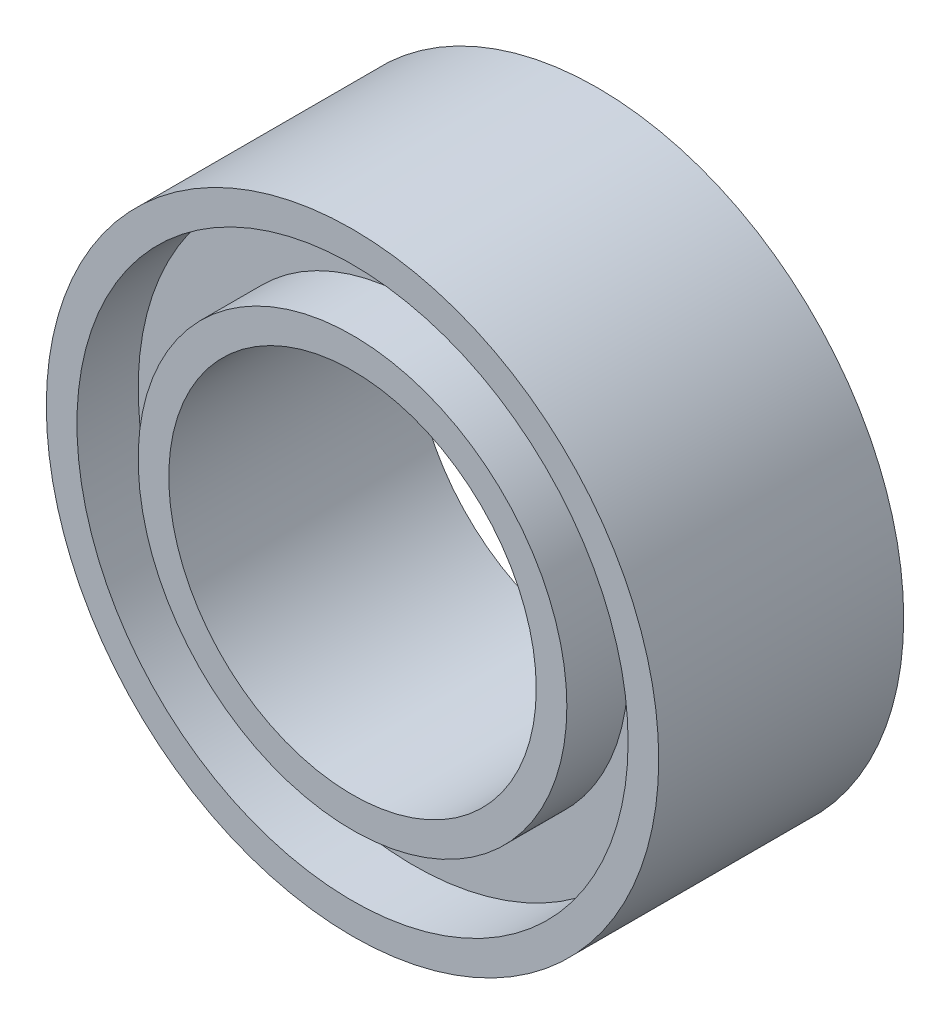
ISO-10303-21;
HEADER;
FILE_DESCRIPTION(('STEP AP214'),'2;1');
FILE_NAME('part.step','',(''),(''),'','','');
FILE_SCHEMA(('AUTOMOTIVE_DESIGN { 1 0 10303 214 1 1 1 1 }'));
ENDSEC;
DATA;
#1=APPLICATION_CONTEXT('core data for automotive mechanical design processes');
#2=APPLICATION_PROTOCOL_DEFINITION('international standard','automotive_design',2000,#1);
#3=PRODUCT_CONTEXT('',#1,'mechanical');
#4=PRODUCT('Part','Part','',(#3));
#5=PRODUCT_RELATED_PRODUCT_CATEGORY('part','',(#4));
#6=PRODUCT_DEFINITION_FORMATION('','',#4);
#7=PRODUCT_DEFINITION_CONTEXT('part definition',#1,'design');
#8=PRODUCT_DEFINITION('design','',#6,#7);
#9=PRODUCT_DEFINITION_SHAPE('','',#8);
#10=(LENGTH_UNIT() NAMED_UNIT(*) SI_UNIT(.MILLI.,.METRE.));
#11=(NAMED_UNIT(*) PLANE_ANGLE_UNIT() SI_UNIT($,.RADIAN.));
#12=(NAMED_UNIT(*) SI_UNIT($,.STERADIAN.) SOLID_ANGLE_UNIT());
#13=UNCERTAINTY_MEASURE_WITH_UNIT(LENGTH_MEASURE(1.E-05),#10,'distance_accuracy_value','');
#14=(GEOMETRIC_REPRESENTATION_CONTEXT(3) GLOBAL_UNCERTAINTY_ASSIGNED_CONTEXT((#13)) GLOBAL_UNIT_ASSIGNED_CONTEXT((#10,
#11,#12)) REPRESENTATION_CONTEXT('',''));
#15=CARTESIAN_POINT('',(0.,0.,0.));
#16=DIRECTION('',(0.,0.,1.));
#17=DIRECTION('',(1.,0.,0.));
#18=AXIS2_PLACEMENT_3D('',#15,#16,#17);
#19=CARTESIAN_POINT('',(0.,0.,0.));
#20=DIRECTION('',(0.,0.,1.));
#21=DIRECTION('',(1.,0.,0.));
#22=AXIS2_PLACEMENT_3D('',#19,#20,#21);
#23=PLANE('',#22);
#24=CARTESIAN_POINT('',(0.,0.,0.));
#25=DIRECTION('',(0.,0.,1.));
#26=DIRECTION('',(1.,0.,0.));
#27=AXIS2_PLACEMENT_3D('',#24,#25,#26);
#28=CIRCLE('',#27,3.);
#29=CARTESIAN_POINT('',(3.,0.,0.));
#30=VERTEX_POINT('',#29);
#31=EDGE_CURVE('E57',#30,#30,#28,.T.);
#32=ORIENTED_EDGE('',*,*,#31,.T.);
#33=EDGE_LOOP('',(#32));
#34=FACE_BOUND('',#33,.T.);
#35=CARTESIAN_POINT('',(0.,0.,0.));
#36=DIRECTION('',(0.,0.,-1.));
#37=DIRECTION('',(-1.,0.,0.));
#38=AXIS2_PLACEMENT_3D('',#35,#36,#37);
#39=CIRCLE('',#38,3.5);
#40=CARTESIAN_POINT('',(-3.5,0.,0.));
#41=VERTEX_POINT('',#40);
#42=EDGE_CURVE('E86',#41,#41,#39,.T.);
#43=ORIENTED_EDGE('',*,*,#42,.T.);
#44=EDGE_LOOP('',(#43));
#45=FACE_BOUND('',#44,.T.);
#46=ADVANCED_FACE('F41',(#34,#45),#23,.F.);
#47=CARTESIAN_POINT('',(0.,0.,4.));
#48=DIRECTION('',(0.,0.,1.));
#49=DIRECTION('',(1.,0.,0.));
#50=AXIS2_PLACEMENT_3D('',#47,#48,#49);
#51=PLANE('',#50);
#52=CARTESIAN_POINT('',(0.,0.,4.));
#53=DIRECTION('',(0.,0.,1.));
#54=DIRECTION('',(1.,0.,0.));
#55=AXIS2_PLACEMENT_3D('',#52,#53,#54);
#56=CIRCLE('',#55,3.);
#57=CARTESIAN_POINT('',(3.,0.,4.));
#58=VERTEX_POINT('',#57);
#59=EDGE_CURVE('E53',#58,#58,#56,.T.);
#60=ORIENTED_EDGE('',*,*,#59,.F.);
#61=EDGE_LOOP('',(#60));
#62=FACE_BOUND('',#61,.T.);
#63=CARTESIAN_POINT('',(0.,0.,4.));
#64=DIRECTION('',(0.,0.,1.));
#65=DIRECTION('',(1.,0.,0.));
#66=AXIS2_PLACEMENT_3D('',#63,#64,#65);
#67=CIRCLE('',#66,3.5);
#68=CARTESIAN_POINT('',(3.5,0.,4.));
#69=VERTEX_POINT('',#68);
#70=EDGE_CURVE('E75',#69,#69,#67,.T.);
#71=ORIENTED_EDGE('',*,*,#70,.T.);
#72=EDGE_LOOP('',(#71));
#73=FACE_BOUND('',#72,.T.);
#74=ADVANCED_FACE('F126',(#62,#73),#51,.T.);
#75=CARTESIAN_POINT('',(0.,0.,4.));
#76=DIRECTION('',(0.,0.,1.));
#77=DIRECTION('',(1.,0.,0.));
#78=AXIS2_PLACEMENT_3D('',#75,#76,#77);
#79=CIRCLE('',#78,4.5);
#80=CARTESIAN_POINT('',(4.5,0.,4.));
#81=VERTEX_POINT('',#80);
#82=EDGE_CURVE('E61',#81,#81,#79,.T.);
#83=ORIENTED_EDGE('',*,*,#82,.F.);
#84=EDGE_LOOP('',(#83));
#85=FACE_BOUND('',#84,.T.);
#86=CARTESIAN_POINT('',(0.,0.,4.));
#87=DIRECTION('',(0.,0.,1.));
#88=DIRECTION('',(1.,0.,0.));
#89=AXIS2_PLACEMENT_3D('',#86,#87,#88);
#90=CIRCLE('',#89,5.);
#91=CARTESIAN_POINT('',(5.,0.,4.));
#92=VERTEX_POINT('',#91);
#93=EDGE_CURVE('E10',#92,#92,#90,.T.);
#94=ORIENTED_EDGE('',*,*,#93,.T.);
#95=EDGE_LOOP('',(#94));
#96=FACE_BOUND('',#95,.T.);
#97=ADVANCED_FACE('F113',(#85,#96),#51,.T.);
#98=CARTESIAN_POINT('',(0.,0.,0.));
#99=DIRECTION('',(0.,0.,-1.));
#100=DIRECTION('',(-1.,0.,0.));
#101=AXIS2_PLACEMENT_3D('',#98,#99,#100);
#102=CIRCLE('',#101,4.5);
#103=CARTESIAN_POINT('',(-4.5,0.,0.));
#104=VERTEX_POINT('',#103);
#105=EDGE_CURVE('E78',#104,#104,#102,.T.);
#106=ORIENTED_EDGE('',*,*,#105,.F.);
#107=EDGE_LOOP('',(#106));
#108=FACE_BOUND('',#107,.T.);
#109=CARTESIAN_POINT('',(0.,0.,0.));
#110=DIRECTION('',(0.,0.,1.));
#111=DIRECTION('',(1.,0.,0.));
#112=AXIS2_PLACEMENT_3D('',#109,#110,#111);
#113=CIRCLE('',#112,5.);
#114=CARTESIAN_POINT('',(5.,0.,0.));
#115=VERTEX_POINT('',#114);
#116=EDGE_CURVE('E44',#115,#115,#113,.T.);
#117=ORIENTED_EDGE('',*,*,#116,.F.);
#118=EDGE_LOOP('',(#117));
#119=FACE_BOUND('',#118,.T.);
#120=ADVANCED_FACE('F115',(#108,#119),#23,.F.);
#121=CARTESIAN_POINT('',(0.,0.,4.));
#122=DIRECTION('',(0.,0.,-1.));
#123=DIRECTION('',(-1.,0.,0.));
#124=AXIS2_PLACEMENT_3D('',#121,#122,#123);
#125=CYLINDRICAL_SURFACE('',#124,5.);
#126=ORIENTED_EDGE('',*,*,#93,.F.);
#127=EDGE_LOOP('',(#126));
#128=FACE_BOUND('',#127,.T.);
#129=ORIENTED_EDGE('',*,*,#116,.T.);
#130=EDGE_LOOP('',(#129));
#131=FACE_BOUND('',#130,.T.);
#132=ADVANCED_FACE('F43',(#128,#131),#125,.T.);
#133=CARTESIAN_POINT('',(0.,0.,4.));
#134=DIRECTION('',(0.,0.,-1.));
#135=DIRECTION('',(-1.,0.,0.));
#136=AXIS2_PLACEMENT_3D('',#133,#134,#135);
#137=CYLINDRICAL_SURFACE('',#136,3.);
#138=ORIENTED_EDGE('',*,*,#59,.T.);
#139=EDGE_LOOP('',(#138));
#140=FACE_BOUND('',#139,.T.);
#141=ORIENTED_EDGE('',*,*,#31,.F.);
#142=EDGE_LOOP('',(#141));
#143=FACE_BOUND('',#142,.T.);
#144=ADVANCED_FACE('F116',(#140,#143),#137,.F.);
#145=CARTESIAN_POINT('',(0.,0.,3.));
#146=DIRECTION('',(0.,0.,1.));
#147=DIRECTION('',(1.,0.,0.));
#148=AXIS2_PLACEMENT_3D('',#145,#146,#147);
#149=CYLINDRICAL_SURFACE('',#148,4.5);
#150=CARTESIAN_POINT('',(0.,0.,3.));
#151=DIRECTION('',(0.,0.,1.));
#152=DIRECTION('',(1.,0.,0.));
#153=AXIS2_PLACEMENT_3D('',#150,#151,#152);
#154=CIRCLE('',#153,4.5);
#155=CARTESIAN_POINT('',(4.5,0.,3.));
#156=VERTEX_POINT('',#155);
#157=EDGE_CURVE('E58',#156,#156,#154,.T.);
#158=ORIENTED_EDGE('',*,*,#157,.F.);
#159=EDGE_LOOP('',(#158));
#160=FACE_BOUND('',#159,.T.);
#161=ORIENTED_EDGE('',*,*,#82,.T.);
#162=EDGE_LOOP('',(#161));
#163=FACE_BOUND('',#162,.T.);
#164=ADVANCED_FACE('F122',(#160,#163),#149,.F.);
#165=CARTESIAN_POINT('',(0.,0.,3.));
#166=DIRECTION('',(0.,0.,1.));
#167=DIRECTION('',(1.,0.,0.));
#168=AXIS2_PLACEMENT_3D('',#165,#166,#167);
#169=PLANE('',#168);
#170=CARTESIAN_POINT('',(0.,0.,3.));
#171=DIRECTION('',(0.,0.,1.));
#172=DIRECTION('',(1.,0.,0.));
#173=AXIS2_PLACEMENT_3D('',#170,#171,#172);
#174=CIRCLE('',#173,3.5);
#175=CARTESIAN_POINT('',(3.5,0.,3.));
#176=VERTEX_POINT('',#175);
#177=EDGE_CURVE('E68',#176,#176,#174,.T.);
#178=ORIENTED_EDGE('',*,*,#177,.F.);
#179=EDGE_LOOP('',(#178));
#180=FACE_BOUND('',#179,.T.);
#181=ORIENTED_EDGE('',*,*,#157,.T.);
#182=EDGE_LOOP('',(#181));
#183=FACE_BOUND('',#182,.T.);
#184=ADVANCED_FACE('F142',(#180,#183),#169,.T.);
#185=CARTESIAN_POINT('',(0.,0.,3.));
#186=DIRECTION('',(0.,0.,1.));
#187=DIRECTION('',(1.,0.,0.));
#188=AXIS2_PLACEMENT_3D('',#185,#186,#187);
#189=CYLINDRICAL_SURFACE('',#188,3.5);
#190=ORIENTED_EDGE('',*,*,#177,.T.);
#191=EDGE_LOOP('',(#190));
#192=FACE_BOUND('',#191,.T.);
#193=ORIENTED_EDGE('',*,*,#70,.F.);
#194=EDGE_LOOP('',(#193));
#195=FACE_BOUND('',#194,.T.);
#196=ADVANCED_FACE('F107',(#192,#195),#189,.T.);
#197=CARTESIAN_POINT('',(0.,0.,1.));
#198=DIRECTION('',(0.,0.,-1.));
#199=DIRECTION('',(-1.,0.,0.));
#200=AXIS2_PLACEMENT_3D('',#197,#198,#199);
#201=CYLINDRICAL_SURFACE('',#200,4.5);
#202=CARTESIAN_POINT('',(0.,0.,1.));
#203=DIRECTION('',(0.,0.,-1.));
#204=DIRECTION('',(-1.,0.,0.));
#205=AXIS2_PLACEMENT_3D('',#202,#203,#204);
#206=CIRCLE('',#205,4.5);
#207=CARTESIAN_POINT('',(-4.5,0.,1.));
#208=VERTEX_POINT('',#207);
#209=EDGE_CURVE('E77',#208,#208,#206,.T.);
#210=ORIENTED_EDGE('',*,*,#209,.F.);
#211=EDGE_LOOP('',(#210));
#212=FACE_BOUND('',#211,.T.);
#213=ORIENTED_EDGE('',*,*,#105,.T.);
#214=EDGE_LOOP('',(#213));
#215=FACE_BOUND('',#214,.T.);
#216=ADVANCED_FACE('F105',(#212,#215),#201,.F.);
#217=CARTESIAN_POINT('',(0.,0.,1.));
#218=DIRECTION('',(0.,0.,-1.));
#219=DIRECTION('',(-1.,0.,0.));
#220=AXIS2_PLACEMENT_3D('',#217,#218,#219);
#221=PLANE('',#220);
#222=CARTESIAN_POINT('',(0.,0.,1.));
#223=DIRECTION('',(0.,0.,-1.));
#224=DIRECTION('',(-1.,0.,0.));
#225=AXIS2_PLACEMENT_3D('',#222,#223,#224);
#226=CIRCLE('',#225,3.5);
#227=CARTESIAN_POINT('',(-3.5,0.,1.));
#228=VERTEX_POINT('',#227);
#229=EDGE_CURVE('E82',#228,#228,#226,.T.);
#230=ORIENTED_EDGE('',*,*,#229,.F.);
#231=EDGE_LOOP('',(#230));
#232=FACE_BOUND('',#231,.T.);
#233=ORIENTED_EDGE('',*,*,#209,.T.);
#234=EDGE_LOOP('',(#233));
#235=FACE_BOUND('',#234,.T.);
#236=ADVANCED_FACE('F97',(#232,#235),#221,.T.);
#237=CARTESIAN_POINT('',(0.,0.,1.));
#238=DIRECTION('',(0.,0.,-1.));
#239=DIRECTION('',(-1.,0.,0.));
#240=AXIS2_PLACEMENT_3D('',#237,#238,#239);
#241=CYLINDRICAL_SURFACE('',#240,3.5);
#242=ORIENTED_EDGE('',*,*,#229,.T.);
#243=EDGE_LOOP('',(#242));
#244=FACE_BOUND('',#243,.T.);
#245=ORIENTED_EDGE('',*,*,#42,.F.);
#246=EDGE_LOOP('',(#245));
#247=FACE_BOUND('',#246,.T.);
#248=ADVANCED_FACE('F96',(#244,#247),#241,.T.);
#249=CLOSED_SHELL('',(#46,#74,#97,#120,#132,#144,#164,#184,#196,#216,#236,#248));
#250=MANIFOLD_SOLID_BREP('B2',#249);
#251=ADVANCED_BREP_SHAPE_REPRESENTATION('',(#18,#250),#14);
#252=SHAPE_DEFINITION_REPRESENTATION(#9,#251);
ENDSEC;
END-ISO-10303-21;
